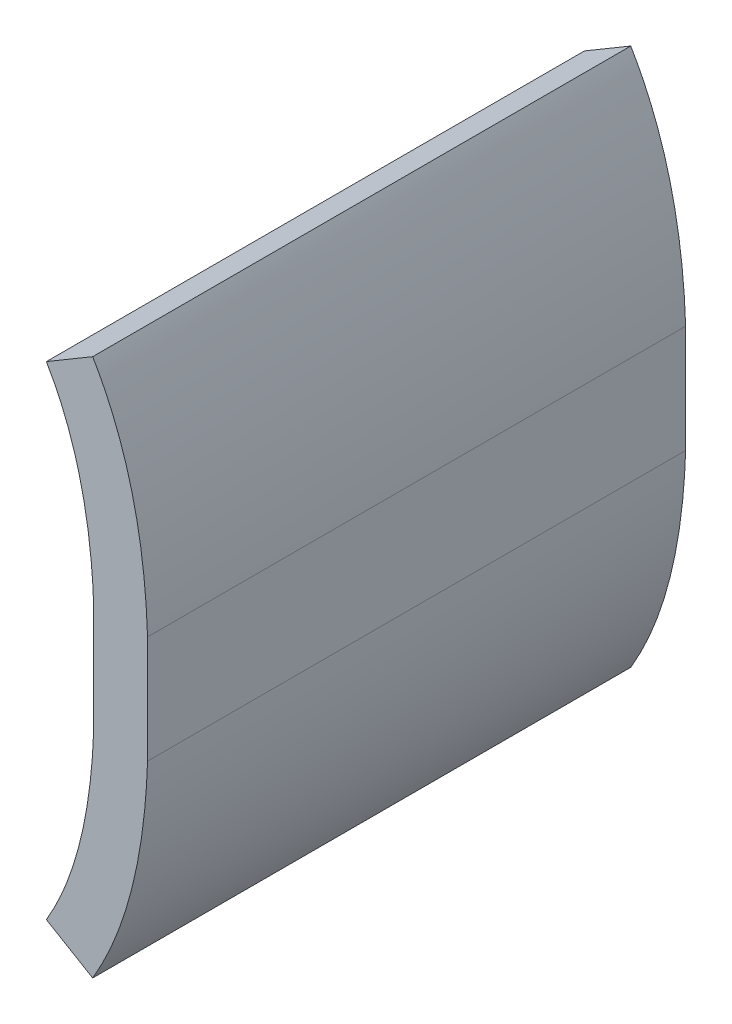
ISO-10303-21;
HEADER;
FILE_DESCRIPTION(('STEP AP214'),'2;1');
FILE_NAME('part.step','',(''),(''),'','','');
FILE_SCHEMA(('AUTOMOTIVE_DESIGN { 1 0 10303 214 1 1 1 1 }'));
ENDSEC;
DATA;
#1=APPLICATION_CONTEXT('core data for automotive mechanical design processes');
#2=APPLICATION_PROTOCOL_DEFINITION('international standard','automotive_design',2000,#1);
#3=PRODUCT_CONTEXT('',#1,'mechanical');
#4=PRODUCT('Part','Part','',(#3));
#5=PRODUCT_RELATED_PRODUCT_CATEGORY('part','',(#4));
#6=PRODUCT_DEFINITION_FORMATION('','',#4);
#7=PRODUCT_DEFINITION_CONTEXT('part definition',#1,'design');
#8=PRODUCT_DEFINITION('design','',#6,#7);
#9=PRODUCT_DEFINITION_SHAPE('','',#8);
#10=(LENGTH_UNIT() NAMED_UNIT(*) SI_UNIT(.MILLI.,.METRE.));
#11=(NAMED_UNIT(*) PLANE_ANGLE_UNIT() SI_UNIT($,.RADIAN.));
#12=(NAMED_UNIT(*) SI_UNIT($,.STERADIAN.) SOLID_ANGLE_UNIT());
#13=UNCERTAINTY_MEASURE_WITH_UNIT(LENGTH_MEASURE(1.E-05),#10,'distance_accuracy_value','');
#14=(GEOMETRIC_REPRESENTATION_CONTEXT(3) GLOBAL_UNCERTAINTY_ASSIGNED_CONTEXT((#13)) GLOBAL_UNIT_ASSIGNED_CONTEXT((#10,
#11,#12)) REPRESENTATION_CONTEXT('',''));
#15=CARTESIAN_POINT('',(0.,0.,0.));
#16=DIRECTION('',(0.,0.,1.));
#17=DIRECTION('',(1.,0.,0.));
#18=AXIS2_PLACEMENT_3D('',#15,#16,#17);
#19=CARTESIAN_POINT('',(0.,0.,100.));
#20=DIRECTION('',(-1.,0.,0.));
#21=DIRECTION('',(0.,0.,1.));
#22=AXIS2_PLACEMENT_3D('',#19,#20,#21);
#23=PLANE('',#22);
#24=DIRECTION('',(0.,1.,0.));
#25=VECTOR('',#24,1.);
#26=CARTESIAN_POINT('',(0.,0.,0.));
#27=LINE('',#26,#25);
#28=CARTESIAN_POINT('',(0.,-10.,0.));
#29=VERTEX_POINT('',#28);
#30=CARTESIAN_POINT('',(0.,10.,0.));
#31=VERTEX_POINT('',#30);
#32=EDGE_CURVE('E85',#29,#31,#27,.T.);
#33=ORIENTED_EDGE('',*,*,#32,.T.);
#34=DIRECTION('',(0.,0.,-1.));
#35=VECTOR('',#34,1.);
#36=CARTESIAN_POINT('',(0.,10.,100.));
#37=LINE('',#36,#35);
#38=CARTESIAN_POINT('',(0.,10.,100.));
#39=VERTEX_POINT('',#38);
#40=EDGE_CURVE('E11',#39,#31,#37,.T.);
#41=ORIENTED_EDGE('',*,*,#40,.F.);
#42=DIRECTION('',(0.,1.,0.));
#43=VECTOR('',#42,1.);
#44=CARTESIAN_POINT('',(0.,0.,100.));
#45=LINE('',#44,#43);
#46=CARTESIAN_POINT('',(0.,-10.,100.));
#47=VERTEX_POINT('',#46);
#48=EDGE_CURVE('E91',#47,#39,#45,.T.);
#49=ORIENTED_EDGE('',*,*,#48,.F.);
#50=DIRECTION('',(0.,0.,-1.));
#51=VECTOR('',#50,1.);
#52=CARTESIAN_POINT('',(0.,-10.,100.));
#53=LINE('',#52,#51);
#54=EDGE_CURVE('E125',#47,#29,#53,.T.);
#55=ORIENTED_EDGE('',*,*,#54,.T.);
#56=EDGE_LOOP('',(#33,#41,#49,#55));
#57=FACE_BOUND('',#56,.T.);
#58=ADVANCED_FACE('F33',(#57),#23,.F.);
#59=CARTESIAN_POINT('',(0.,10.,100.));
#60=CARTESIAN_POINT('',(-0.787242098837939,34.1007338692623,100.));
#61=CARTESIAN_POINT('',(-10.1975344829217,50.,100.));
#62=B_SPLINE_CURVE_WITH_KNOTS('',2,(#59,#60,#61),.UNSPECIFIED.,.F.,.F.,(3,3),(0.,1.),.UNSPECIFIED.);
#63=DIRECTION('',(0.,0.,-1.));
#64=VECTOR('',#63,1.);
#65=SURFACE_OF_LINEAR_EXTRUSION('',#62,#64);
#66=CARTESIAN_POINT('',(0.,10.,0.));
#67=CARTESIAN_POINT('',(-0.787242098837939,34.1007338692623,0.));
#68=CARTESIAN_POINT('',(-10.1975344829217,50.,0.));
#69=B_SPLINE_CURVE_WITH_KNOTS('',2,(#66,#67,#68),.UNSPECIFIED.,.F.,.F.,(3,3),(0.,1.),.UNSPECIFIED.);
#70=CARTESIAN_POINT('',(-10.1975344829217,50.,0.));
#71=VERTEX_POINT('',#70);
#72=EDGE_CURVE('E189',#31,#71,#69,.T.);
#73=ORIENTED_EDGE('',*,*,#72,.T.);
#74=DIRECTION('',(0.,0.,-1.));
#75=VECTOR('',#74,1.);
#76=CARTESIAN_POINT('',(-10.1975344829217,50.,100.));
#77=LINE('',#76,#75);
#78=CARTESIAN_POINT('',(-10.1975344829217,50.,100.));
#79=VERTEX_POINT('',#78);
#80=EDGE_CURVE('E41',#79,#71,#77,.T.);
#81=ORIENTED_EDGE('',*,*,#80,.F.);
#82=EDGE_CURVE('E171',#39,#79,#62,.T.);
#83=ORIENTED_EDGE('',*,*,#82,.F.);
#84=ORIENTED_EDGE('',*,*,#40,.T.);
#85=EDGE_LOOP('',(#73,#81,#83,#84));
#86=FACE_BOUND('',#85,.T.);
#87=ADVANCED_FACE('F179',(#86),#65,.F.);
#88=CARTESIAN_POINT('',(-18.803177319276,44.9065815631245,100.));
#89=DIRECTION('',(0.509341843687553,-0.860564283635432,0.));
#90=DIRECTION('',(0.860564283635432,0.509341843687553,0.));
#91=AXIS2_PLACEMENT_3D('',#88,#89,#90);
#92=PLANE('',#91);
#93=DIRECTION('',(-0.860564283635432,-0.509341843687553,0.));
#94=VECTOR('',#93,1.);
#95=CARTESIAN_POINT('',(-18.803177319276,44.9065815631245,0.));
#96=LINE('',#95,#94);
#97=CARTESIAN_POINT('',(-18.803177319276,44.9065815631245,0.));
#98=VERTEX_POINT('',#97);
#99=EDGE_CURVE('E194',#71,#98,#96,.T.);
#100=ORIENTED_EDGE('',*,*,#99,.T.);
#101=DIRECTION('',(0.,0.,-1.));
#102=VECTOR('',#101,1.);
#103=CARTESIAN_POINT('',(-18.803177319276,44.9065815631245,100.));
#104=LINE('',#103,#102);
#105=CARTESIAN_POINT('',(-18.803177319276,44.9065815631245,100.));
#106=VERTEX_POINT('',#105);
#107=EDGE_CURVE('E197',#106,#98,#104,.T.);
#108=ORIENTED_EDGE('',*,*,#107,.F.);
#109=DIRECTION('',(-0.860564283635432,-0.509341843687553,0.));
#110=VECTOR('',#109,1.);
#111=CARTESIAN_POINT('',(-18.803177319276,44.9065815631245,100.));
#112=LINE('',#111,#110);
#113=EDGE_CURVE('E166',#79,#106,#112,.T.);
#114=ORIENTED_EDGE('',*,*,#113,.F.);
#115=ORIENTED_EDGE('',*,*,#80,.T.);
#116=EDGE_LOOP('',(#100,#108,#114,#115));
#117=FACE_BOUND('',#116,.T.);
#118=ADVANCED_FACE('F159',(#117),#92,.F.);
#119=CARTESIAN_POINT('',(-18.803177319276,44.9065815631245,100.));
#120=CARTESIAN_POINT('',(-18.1443091705549,43.7933834164545,100.));
#121=CARTESIAN_POINT('',(-16.9287032272346,41.5441852366715,100.));
#122=CARTESIAN_POINT('',(-14.7288288532443,36.6348577641002,100.));
#123=CARTESIAN_POINT('',(-12.9496704925132,31.1969076455493,100.));
#124=CARTESIAN_POINT('',(-11.6034304892979,25.1760451784191,100.));
#125=CARTESIAN_POINT('',(-10.8202697582534,20.3719560367332,100.));
#126=CARTESIAN_POINT('',(-10.3615309995751,16.1193342605473,100.));
#127=CARTESIAN_POINT('',(-10.1147060963108,12.582680834939,100.));
#128=CARTESIAN_POINT('',(-10.0309673528903,10.7444716956188,100.));
#129=CARTESIAN_POINT('',(-10.,9.83347106547649,100.));
#130=B_SPLINE_CURVE_WITH_KNOTS('',3,(#119,#120,#121,#122,#123,#124,#125,#126,#127,#128,#129),
.UNSPECIFIED.,.F.,.F.,(4,1,1,1,1,1,1,1,4),(0.0035954852627462,0.128146049604903,
0.25269661394706,0.501797742631373,0.62634830697353,0.750898871315687,0.875449435657843,
0.937724717828922,1.),.UNSPECIFIED.);
#131=DIRECTION('',(0.,0.,-1.));
#132=VECTOR('',#131,1.);
#133=SURFACE_OF_LINEAR_EXTRUSION('',#130,#132);
#134=CARTESIAN_POINT('',(-18.803177319276,44.9065815631245,0.));
#135=CARTESIAN_POINT('',(-18.1443091705549,43.7933834164545,0.));
#136=CARTESIAN_POINT('',(-16.9287032272346,41.5441852366715,0.));
#137=CARTESIAN_POINT('',(-14.7288288532443,36.6348577641002,0.));
#138=CARTESIAN_POINT('',(-12.9496704925132,31.1969076455493,0.));
#139=CARTESIAN_POINT('',(-11.6034304892979,25.1760451784191,0.));
#140=CARTESIAN_POINT('',(-10.8202697582534,20.3719560367332,0.));
#141=CARTESIAN_POINT('',(-10.3615309995751,16.1193342605473,0.));
#142=CARTESIAN_POINT('',(-10.1147060963108,12.582680834939,0.));
#143=CARTESIAN_POINT('',(-10.0309673528903,10.7444716956188,0.));
#144=CARTESIAN_POINT('',(-10.,9.83347106547649,0.));
#145=B_SPLINE_CURVE_WITH_KNOTS('',3,(#134,#135,#136,#137,#138,#139,#140,#141,#142,#143,#144),
.UNSPECIFIED.,.F.,.F.,(4,1,1,1,1,1,1,1,4),(0.0035954852627462,0.128146049604903,
0.25269661394706,0.501797742631373,0.62634830697353,0.750898871315687,0.875449435657843,
0.937724717828922,1.),.UNSPECIFIED.);
#146=CARTESIAN_POINT('',(-10.,9.83347106547649,0.));
#147=VERTEX_POINT('',#146);
#148=EDGE_CURVE('E200',#98,#147,#145,.T.);
#149=ORIENTED_EDGE('',*,*,#148,.T.);
#150=DIRECTION('',(0.,0.,-1.));
#151=VECTOR('',#150,1.);
#152=CARTESIAN_POINT('',(-10.,9.83347106547649,100.));
#153=LINE('',#152,#151);
#154=CARTESIAN_POINT('',(-10.,9.83347106547649,100.));
#155=VERTEX_POINT('',#154);
#156=EDGE_CURVE('E231',#155,#147,#153,.T.);
#157=ORIENTED_EDGE('',*,*,#156,.F.);
#158=EDGE_CURVE('E161',#106,#155,#130,.T.);
#159=ORIENTED_EDGE('',*,*,#158,.F.);
#160=ORIENTED_EDGE('',*,*,#107,.T.);
#161=EDGE_LOOP('',(#149,#157,#159,#160));
#162=FACE_BOUND('',#161,.T.);
#163=ADVANCED_FACE('F154',(#162),#133,.F.);
#164=CARTESIAN_POINT('',(-10.,0.,100.));
#165=DIRECTION('',(1.,0.,0.));
#166=DIRECTION('',(0.,1.,0.));
#167=AXIS2_PLACEMENT_3D('',#164,#165,#166);
#168=PLANE('',#167);
#169=DIRECTION('',(0.,-1.,0.));
#170=VECTOR('',#169,1.);
#171=CARTESIAN_POINT('',(-10.,0.,0.));
#172=LINE('',#171,#170);
#173=CARTESIAN_POINT('',(-10.,-9.83347106547652,0.));
#174=VERTEX_POINT('',#173);
#175=EDGE_CURVE('E202',#147,#174,#172,.T.);
#176=ORIENTED_EDGE('',*,*,#175,.T.);
#177=DIRECTION('',(0.,0.,-1.));
#178=VECTOR('',#177,1.);
#179=CARTESIAN_POINT('',(-10.,-9.83347106547652,100.));
#180=LINE('',#179,#178);
#181=CARTESIAN_POINT('',(-10.,-9.83347106547652,100.));
#182=VERTEX_POINT('',#181);
#183=EDGE_CURVE('E120',#182,#174,#180,.T.);
#184=ORIENTED_EDGE('',*,*,#183,.F.);
#185=DIRECTION('',(0.,-1.,0.));
#186=VECTOR('',#185,1.);
#187=CARTESIAN_POINT('',(-10.,0.,100.));
#188=LINE('',#187,#186);
#189=EDGE_CURVE('E111',#155,#182,#188,.T.);
#190=ORIENTED_EDGE('',*,*,#189,.F.);
#191=ORIENTED_EDGE('',*,*,#156,.T.);
#192=EDGE_LOOP('',(#176,#184,#190,#191));
#193=FACE_BOUND('',#192,.T.);
#194=ADVANCED_FACE('F151',(#193),#168,.F.);
#195=CARTESIAN_POINT('',(-10.,-9.83347106547652,100.));
#196=CARTESIAN_POINT('',(-10.0309673528903,-10.7444716956188,100.));
#197=CARTESIAN_POINT('',(-10.1147060963108,-12.582680834939,100.));
#198=CARTESIAN_POINT('',(-10.3615309995751,-16.1193342605473,100.));
#199=CARTESIAN_POINT('',(-10.8202697582534,-20.3719560367332,100.));
#200=CARTESIAN_POINT('',(-11.6034304892979,-25.1760451784191,100.));
#201=CARTESIAN_POINT('',(-12.9496704925132,-31.1969076455493,100.));
#202=CARTESIAN_POINT('',(-14.7288288532443,-36.6348577641003,100.));
#203=CARTESIAN_POINT('',(-16.9287032272346,-41.5441852366715,100.));
#204=CARTESIAN_POINT('',(-18.1443091705548,-43.7933834164545,100.));
#205=CARTESIAN_POINT('',(-18.803177319276,-44.9065815631245,100.));
#206=B_SPLINE_CURVE_WITH_KNOTS('',3,(#195,#196,#197,#198,#199,#200,#201,#202,#203,#204,#205),
.UNSPECIFIED.,.F.,.F.,(4,1,1,1,1,1,1,1,4),(0.00359548526274667,0.065870767433825,
0.128146049604903,0.25269661394706,0.377247178289217,0.501797742631373,0.750898871315687,
0.875449435657843,1.),.UNSPECIFIED.);
#207=DIRECTION('',(0.,0.,-1.));
#208=VECTOR('',#207,1.);
#209=SURFACE_OF_LINEAR_EXTRUSION('',#206,#208);
#210=CARTESIAN_POINT('',(-10.,-9.83347106547652,0.));
#211=CARTESIAN_POINT('',(-10.0309673528903,-10.7444716956188,0.));
#212=CARTESIAN_POINT('',(-10.1147060963108,-12.582680834939,0.));
#213=CARTESIAN_POINT('',(-10.3615309995751,-16.1193342605473,0.));
#214=CARTESIAN_POINT('',(-10.8202697582534,-20.3719560367332,0.));
#215=CARTESIAN_POINT('',(-11.6034304892979,-25.1760451784191,0.));
#216=CARTESIAN_POINT('',(-12.9496704925132,-31.1969076455493,0.));
#217=CARTESIAN_POINT('',(-14.7288288532443,-36.6348577641003,0.));
#218=CARTESIAN_POINT('',(-16.9287032272346,-41.5441852366715,0.));
#219=CARTESIAN_POINT('',(-18.1443091705548,-43.7933834164545,0.));
#220=CARTESIAN_POINT('',(-18.803177319276,-44.9065815631245,0.));
#221=B_SPLINE_CURVE_WITH_KNOTS('',3,(#210,#211,#212,#213,#214,#215,#216,#217,#218,#219,#220),
.UNSPECIFIED.,.F.,.F.,(4,1,1,1,1,1,1,1,4),(0.00359548526274667,0.065870767433825,
0.128146049604903,0.25269661394706,0.377247178289217,0.501797742631373,0.750898871315687,
0.875449435657843,1.),.UNSPECIFIED.);
#222=CARTESIAN_POINT('',(-18.803177319276,-44.9065815631245,0.));
#223=VERTEX_POINT('',#222);
#224=EDGE_CURVE('E119',#174,#223,#221,.T.);
#225=ORIENTED_EDGE('',*,*,#224,.T.);
#226=DIRECTION('',(0.,0.,-1.));
#227=VECTOR('',#226,1.);
#228=CARTESIAN_POINT('',(-18.803177319276,-44.9065815631245,100.));
#229=LINE('',#228,#227);
#230=CARTESIAN_POINT('',(-18.803177319276,-44.9065815631245,100.));
#231=VERTEX_POINT('',#230);
#232=EDGE_CURVE('E116',#231,#223,#229,.T.);
#233=ORIENTED_EDGE('',*,*,#232,.F.);
#234=EDGE_CURVE('E105',#182,#231,#206,.T.);
#235=ORIENTED_EDGE('',*,*,#234,.F.);
#236=ORIENTED_EDGE('',*,*,#183,.T.);
#237=EDGE_LOOP('',(#225,#233,#235,#236));
#238=FACE_BOUND('',#237,.T.);
#239=ADVANCED_FACE('F117',(#238),#209,.F.);
#240=CARTESIAN_POINT('',(-10.1975344829217,-50.,100.));
#241=DIRECTION('',(0.509341843687554,0.860564283635432,0.));
#242=DIRECTION('',(-0.860564283635432,0.509341843687554,0.));
#243=AXIS2_PLACEMENT_3D('',#240,#241,#242);
#244=PLANE('',#243);
#245=DIRECTION('',(0.860564283635432,-0.509341843687554,0.));
#246=VECTOR('',#245,1.);
#247=CARTESIAN_POINT('',(-10.1975344829217,-50.,0.));
#248=LINE('',#247,#246);
#249=CARTESIAN_POINT('',(-10.1975344829217,-50.,0.));
#250=VERTEX_POINT('',#249);
#251=EDGE_CURVE('E78',#223,#250,#248,.T.);
#252=ORIENTED_EDGE('',*,*,#251,.T.);
#253=DIRECTION('',(0.,0.,-1.));
#254=VECTOR('',#253,1.);
#255=CARTESIAN_POINT('',(-10.1975344829217,-50.,100.));
#256=LINE('',#255,#254);
#257=CARTESIAN_POINT('',(-10.1975344829217,-50.,100.));
#258=VERTEX_POINT('',#257);
#259=EDGE_CURVE('E121',#258,#250,#256,.T.);
#260=ORIENTED_EDGE('',*,*,#259,.F.);
#261=DIRECTION('',(0.860564283635432,-0.509341843687554,0.));
#262=VECTOR('',#261,1.);
#263=CARTESIAN_POINT('',(-10.1975344829217,-50.,100.));
#264=LINE('',#263,#262);
#265=EDGE_CURVE('E109',#231,#258,#264,.T.);
#266=ORIENTED_EDGE('',*,*,#265,.F.);
#267=ORIENTED_EDGE('',*,*,#232,.T.);
#268=EDGE_LOOP('',(#252,#260,#266,#267));
#269=FACE_BOUND('',#268,.T.);
#270=ADVANCED_FACE('F123',(#269),#244,.F.);
#271=CARTESIAN_POINT('',(-10.1975344829217,-50.,100.));
#272=CARTESIAN_POINT('',(-0.787242098837931,-34.1007338692623,100.));
#273=CARTESIAN_POINT('',(0.,-10.,100.));
#274=B_SPLINE_CURVE_WITH_KNOTS('',2,(#271,#272,#273),.UNSPECIFIED.,.F.,.F.,(3,3),(0.,1.),.UNSPECIFIED.);
#275=DIRECTION('',(0.,0.,-1.));
#276=VECTOR('',#275,1.);
#277=SURFACE_OF_LINEAR_EXTRUSION('',#274,#276);
#278=CARTESIAN_POINT('',(-10.1975344829217,-50.,0.));
#279=CARTESIAN_POINT('',(-0.787242098837931,-34.1007338692623,0.));
#280=CARTESIAN_POINT('',(0.,-10.,0.));
#281=B_SPLINE_CURVE_WITH_KNOTS('',2,(#278,#279,#280),.UNSPECIFIED.,.F.,.F.,(3,3),(0.,1.),.UNSPECIFIED.);
#282=EDGE_CURVE('E220',#250,#29,#281,.T.);
#283=ORIENTED_EDGE('',*,*,#282,.T.);
#284=ORIENTED_EDGE('',*,*,#54,.F.);
#285=EDGE_CURVE('E49',#258,#47,#274,.T.);
#286=ORIENTED_EDGE('',*,*,#285,.F.);
#287=ORIENTED_EDGE('',*,*,#259,.T.);
#288=EDGE_LOOP('',(#283,#284,#286,#287));
#289=FACE_BOUND('',#288,.T.);
#290=ADVANCED_FACE('F140',(#289),#277,.F.);
#291=CARTESIAN_POINT('',(-2.94300467014939,-32.0503669346312,100.));
#292=DIRECTION('',(0.,0.,1.));
#293=DIRECTION('',(1.,0.,0.));
#294=AXIS2_PLACEMENT_3D('',#291,#292,#293);
#295=PLANE('',#294);
#296=ORIENTED_EDGE('',*,*,#48,.T.);
#297=ORIENTED_EDGE('',*,*,#82,.T.);
#298=ORIENTED_EDGE('',*,*,#113,.T.);
#299=ORIENTED_EDGE('',*,*,#158,.T.);
#300=ORIENTED_EDGE('',*,*,#189,.T.);
#301=ORIENTED_EDGE('',*,*,#234,.T.);
#302=ORIENTED_EDGE('',*,*,#265,.T.);
#303=ORIENTED_EDGE('',*,*,#285,.T.);
#304=EDGE_LOOP('',(#296,#297,#298,#299,#300,#301,#302,#303));
#305=FACE_BOUND('',#304,.T.);
#306=ADVANCED_FACE('F107',(#305),#295,.T.);
#307=CARTESIAN_POINT('',(-2.94300467014939,-32.0503669346312,0.));
#308=DIRECTION('',(0.,0.,1.));
#309=DIRECTION('',(1.,0.,0.));
#310=AXIS2_PLACEMENT_3D('',#307,#308,#309);
#311=PLANE('',#310);
#312=ORIENTED_EDGE('',*,*,#32,.F.);
#313=ORIENTED_EDGE('',*,*,#282,.F.);
#314=ORIENTED_EDGE('',*,*,#251,.F.);
#315=ORIENTED_EDGE('',*,*,#224,.F.);
#316=ORIENTED_EDGE('',*,*,#175,.F.);
#317=ORIENTED_EDGE('',*,*,#148,.F.);
#318=ORIENTED_EDGE('',*,*,#99,.F.);
#319=ORIENTED_EDGE('',*,*,#72,.F.);
#320=EDGE_LOOP('',(#312,#313,#314,#315,#316,#317,#318,#319));
#321=FACE_BOUND('',#320,.T.);
#322=ADVANCED_FACE('F145',(#321),#311,.F.);
#323=CLOSED_SHELL('',(#58,#87,#118,#163,#194,#239,#270,#290,#306,#322));
#324=MANIFOLD_SOLID_BREP('B2',#323);
#325=ADVANCED_BREP_SHAPE_REPRESENTATION('',(#18,#324),#14);
#326=SHAPE_DEFINITION_REPRESENTATION(#9,#325);
ENDSEC;
END-ISO-10303-21;
